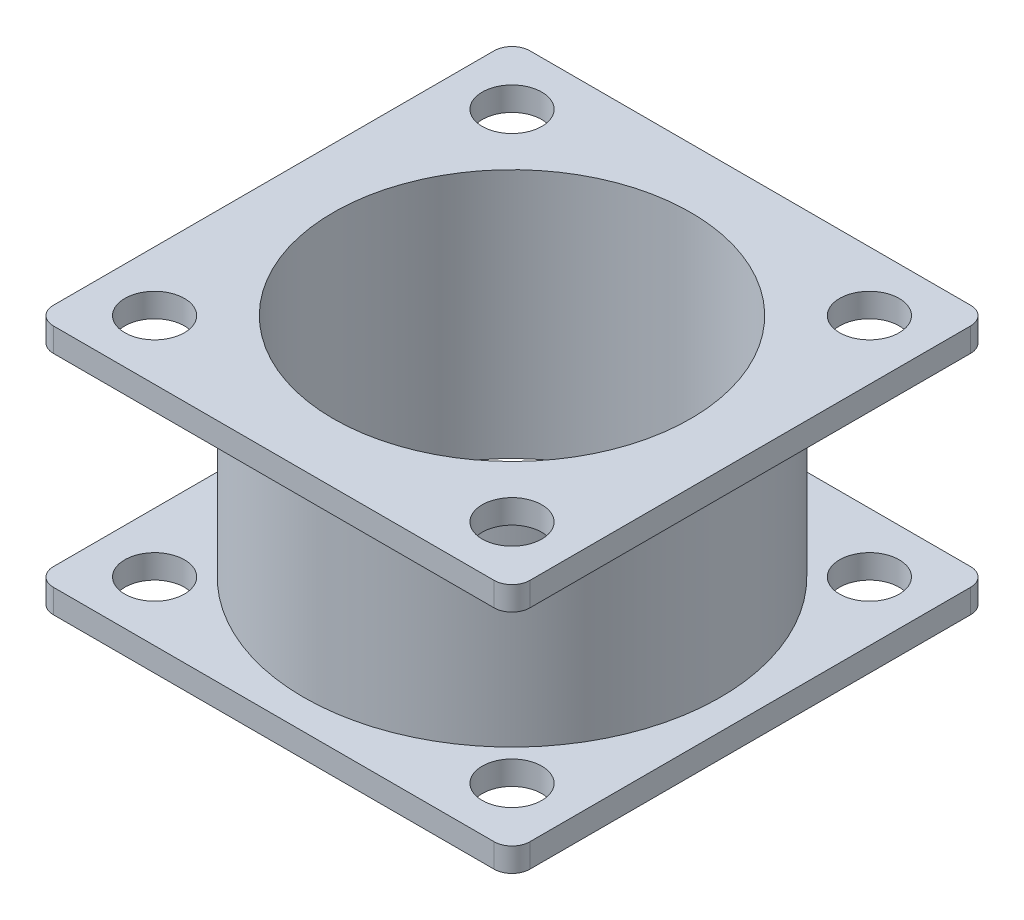
ISO-10303-21;
HEADER;
FILE_DESCRIPTION(('STEP AP214'),'2;1');
FILE_NAME('part.step','',(''),(''),'','','');
FILE_SCHEMA(('AUTOMOTIVE_DESIGN { 1 0 10303 214 1 1 1 1 }'));
ENDSEC;
DATA;
#1=APPLICATION_CONTEXT('core data for automotive mechanical design processes');
#2=APPLICATION_PROTOCOL_DEFINITION('international standard','automotive_design',2000,#1);
#3=PRODUCT_CONTEXT('',#1,'mechanical');
#4=PRODUCT('Part','Part','',(#3));
#5=PRODUCT_RELATED_PRODUCT_CATEGORY('part','',(#4));
#6=PRODUCT_DEFINITION_FORMATION('','',#4);
#7=PRODUCT_DEFINITION_CONTEXT('part definition',#1,'design');
#8=PRODUCT_DEFINITION('design','',#6,#7);
#9=PRODUCT_DEFINITION_SHAPE('','',#8);
#10=(LENGTH_UNIT() NAMED_UNIT(*) SI_UNIT(.MILLI.,.METRE.));
#11=(NAMED_UNIT(*) PLANE_ANGLE_UNIT() SI_UNIT($,.RADIAN.));
#12=(NAMED_UNIT(*) SI_UNIT($,.STERADIAN.) SOLID_ANGLE_UNIT());
#13=UNCERTAINTY_MEASURE_WITH_UNIT(LENGTH_MEASURE(1.E-05),#10,'distance_accuracy_value','');
#14=(GEOMETRIC_REPRESENTATION_CONTEXT(3) GLOBAL_UNCERTAINTY_ASSIGNED_CONTEXT((#13)) GLOBAL_UNIT_ASSIGNED_CONTEXT((#10,
#11,#12)) REPRESENTATION_CONTEXT('',''));
#15=CARTESIAN_POINT('',(0.,0.,0.));
#16=DIRECTION('',(0.,0.,1.));
#17=DIRECTION('',(1.,0.,0.));
#18=AXIS2_PLACEMENT_3D('',#15,#16,#17);
#19=CARTESIAN_POINT('',(-40.,4.,0.));
#20=DIRECTION('',(-1.,0.,0.));
#21=DIRECTION('',(0.,0.,1.));
#22=AXIS2_PLACEMENT_3D('',#19,#20,#21);
#23=PLANE('',#22);
#24=DIRECTION('',(0.,0.,-1.));
#25=VECTOR('',#24,1.);
#26=CARTESIAN_POINT('',(-40.,4.,0.));
#27=LINE('',#26,#25);
#28=CARTESIAN_POINT('',(-40.,4.,37.));
#29=VERTEX_POINT('',#28);
#30=CARTESIAN_POINT('',(-40.,4.,-37.));
#31=VERTEX_POINT('',#30);
#32=EDGE_CURVE('E200',#29,#31,#27,.T.);
#33=ORIENTED_EDGE('',*,*,#32,.T.);
#34=DIRECTION('',(0.,-1.,0.));
#35=VECTOR('',#34,1.);
#36=CARTESIAN_POINT('',(-40.,0.,-37.));
#37=LINE('',#36,#35);
#38=CARTESIAN_POINT('',(-40.,0.,-37.));
#39=VERTEX_POINT('',#38);
#40=EDGE_CURVE('E241',#31,#39,#37,.T.);
#41=ORIENTED_EDGE('',*,*,#40,.T.);
#42=DIRECTION('',(0.,0.,-1.));
#43=VECTOR('',#42,1.);
#44=CARTESIAN_POINT('',(-40.,0.,0.));
#45=LINE('',#44,#43);
#46=CARTESIAN_POINT('',(-40.,0.,37.));
#47=VERTEX_POINT('',#46);
#48=EDGE_CURVE('E202',#47,#39,#45,.T.);
#49=ORIENTED_EDGE('',*,*,#48,.F.);
#50=DIRECTION('',(0.,-1.,0.));
#51=VECTOR('',#50,1.);
#52=CARTESIAN_POINT('',(-40.,4.,37.));
#53=LINE('',#52,#51);
#54=EDGE_CURVE('E238',#47,#29,#53,.F.);
#55=ORIENTED_EDGE('',*,*,#54,.T.);
#56=EDGE_LOOP('',(#33,#41,#49,#55));
#57=FACE_BOUND('',#56,.T.);
#58=ADVANCED_FACE('F49',(#57),#23,.T.);
#59=CARTESIAN_POINT('',(0.,4.,40.));
#60=DIRECTION('',(0.,0.,1.));
#61=DIRECTION('',(1.,0.,0.));
#62=AXIS2_PLACEMENT_3D('',#59,#60,#61);
#63=PLANE('',#62);
#64=DIRECTION('',(-1.,0.,0.));
#65=VECTOR('',#64,1.);
#66=CARTESIAN_POINT('',(0.,4.,40.));
#67=LINE('',#66,#65);
#68=CARTESIAN_POINT('',(37.,4.,40.));
#69=VERTEX_POINT('',#68);
#70=CARTESIAN_POINT('',(-37.,4.,40.));
#71=VERTEX_POINT('',#70);
#72=EDGE_CURVE('E373',#69,#71,#67,.T.);
#73=ORIENTED_EDGE('',*,*,#72,.T.);
#74=DIRECTION('',(0.,-1.,0.));
#75=VECTOR('',#74,1.);
#76=CARTESIAN_POINT('',(-37.,4.,40.));
#77=LINE('',#76,#75);
#78=CARTESIAN_POINT('',(-37.,0.,40.));
#79=VERTEX_POINT('',#78);
#80=EDGE_CURVE('E245',#71,#79,#77,.T.);
#81=ORIENTED_EDGE('',*,*,#80,.T.);
#82=DIRECTION('',(-1.,0.,0.));
#83=VECTOR('',#82,1.);
#84=CARTESIAN_POINT('',(0.,0.,40.));
#85=LINE('',#84,#83);
#86=CARTESIAN_POINT('',(37.,0.,40.));
#87=VERTEX_POINT('',#86);
#88=EDGE_CURVE('E195',#87,#79,#85,.T.);
#89=ORIENTED_EDGE('',*,*,#88,.F.);
#90=DIRECTION('',(0.,-1.,0.));
#91=VECTOR('',#90,1.);
#92=CARTESIAN_POINT('',(37.,4.,40.));
#93=LINE('',#92,#91);
#94=EDGE_CURVE('E172',#87,#69,#93,.F.);
#95=ORIENTED_EDGE('',*,*,#94,.T.);
#96=EDGE_LOOP('',(#73,#81,#89,#95));
#97=FACE_BOUND('',#96,.T.);
#98=ADVANCED_FACE('F396',(#97),#63,.T.);
#99=CARTESIAN_POINT('',(40.,4.,0.));
#100=DIRECTION('',(-1.,0.,0.));
#101=DIRECTION('',(0.,0.,1.));
#102=AXIS2_PLACEMENT_3D('',#99,#100,#101);
#103=PLANE('',#102);
#104=DIRECTION('',(0.,0.,-1.));
#105=VECTOR('',#104,1.);
#106=CARTESIAN_POINT('',(40.,0.,0.));
#107=LINE('',#106,#105);
#108=CARTESIAN_POINT('',(40.,0.,37.));
#109=VERTEX_POINT('',#108);
#110=CARTESIAN_POINT('',(40.,0.,-37.));
#111=VERTEX_POINT('',#110);
#112=EDGE_CURVE('E183',#109,#111,#107,.T.);
#113=ORIENTED_EDGE('',*,*,#112,.T.);
#114=DIRECTION('',(0.,-1.,0.));
#115=VECTOR('',#114,1.);
#116=CARTESIAN_POINT('',(40.,4.,-37.));
#117=LINE('',#116,#115);
#118=CARTESIAN_POINT('',(40.,4.,-37.));
#119=VERTEX_POINT('',#118);
#120=EDGE_CURVE('E226',#111,#119,#117,.F.);
#121=ORIENTED_EDGE('',*,*,#120,.T.);
#122=DIRECTION('',(0.,0.,-1.));
#123=VECTOR('',#122,1.);
#124=CARTESIAN_POINT('',(40.,4.,0.));
#125=LINE('',#124,#123);
#126=CARTESIAN_POINT('',(40.,4.,37.));
#127=VERTEX_POINT('',#126);
#128=EDGE_CURVE('E186',#127,#119,#125,.T.);
#129=ORIENTED_EDGE('',*,*,#128,.F.);
#130=DIRECTION('',(0.,-1.,0.));
#131=VECTOR('',#130,1.);
#132=CARTESIAN_POINT('',(40.,0.,37.));
#133=LINE('',#132,#131);
#134=EDGE_CURVE('E171',#127,#109,#133,.T.);
#135=ORIENTED_EDGE('',*,*,#134,.T.);
#136=EDGE_LOOP('',(#113,#121,#129,#135));
#137=FACE_BOUND('',#136,.T.);
#138=ADVANCED_FACE('F182',(#137),#103,.F.);
#139=CARTESIAN_POINT('',(0.,4.,-40.));
#140=DIRECTION('',(0.,0.,1.));
#141=DIRECTION('',(1.,0.,0.));
#142=AXIS2_PLACEMENT_3D('',#139,#140,#141);
#143=PLANE('',#142);
#144=DIRECTION('',(-1.,0.,0.));
#145=VECTOR('',#144,1.);
#146=CARTESIAN_POINT('',(0.,4.,-40.));
#147=LINE('',#146,#145);
#148=CARTESIAN_POINT('',(37.,4.,-40.));
#149=VERTEX_POINT('',#148);
#150=CARTESIAN_POINT('',(-37.,4.,-40.));
#151=VERTEX_POINT('',#150);
#152=EDGE_CURVE('E188',#149,#151,#147,.T.);
#153=ORIENTED_EDGE('',*,*,#152,.F.);
#154=DIRECTION('',(0.,-1.,0.));
#155=VECTOR('',#154,1.);
#156=CARTESIAN_POINT('',(37.,4.,-40.));
#157=LINE('',#156,#155);
#158=CARTESIAN_POINT('',(37.,0.,-40.));
#159=VERTEX_POINT('',#158);
#160=EDGE_CURVE('E214',#149,#159,#157,.T.);
#161=ORIENTED_EDGE('',*,*,#160,.T.);
#162=DIRECTION('',(-1.,0.,0.));
#163=VECTOR('',#162,1.);
#164=CARTESIAN_POINT('',(0.,0.,-40.));
#165=LINE('',#164,#163);
#166=CARTESIAN_POINT('',(-37.,0.,-40.));
#167=VERTEX_POINT('',#166);
#168=EDGE_CURVE('E194',#159,#167,#165,.T.);
#169=ORIENTED_EDGE('',*,*,#168,.T.);
#170=DIRECTION('',(0.,-1.,0.));
#171=VECTOR('',#170,1.);
#172=CARTESIAN_POINT('',(-37.,4.,-40.));
#173=LINE('',#172,#171);
#174=EDGE_CURVE('E211',#167,#151,#173,.F.);
#175=ORIENTED_EDGE('',*,*,#174,.T.);
#176=EDGE_LOOP('',(#153,#161,#169,#175));
#177=FACE_BOUND('',#176,.T.);
#178=ADVANCED_FACE('F403',(#177),#143,.F.);
#179=CARTESIAN_POINT('',(0.,4.,0.));
#180=DIRECTION('',(0.,1.,0.));
#181=DIRECTION('',(0.,0.,1.));
#182=AXIS2_PLACEMENT_3D('',#179,#180,#181);
#183=PLANE('',#182);
#184=CARTESIAN_POINT('',(-30.0000000000002,4.,29.9999999999998));
#185=DIRECTION('',(0.,1.,0.));
#186=DIRECTION('',(0.,0.,1.));
#187=AXIS2_PLACEMENT_3D('',#184,#185,#186);
#188=CIRCLE('',#187,5.);
#189=CARTESIAN_POINT('',(-30.0000000000002,4.,34.9999999999998));
#190=VERTEX_POINT('',#189);
#191=EDGE_CURVE('E322',#190,#190,#188,.T.);
#192=ORIENTED_EDGE('',*,*,#191,.F.);
#193=EDGE_LOOP('',(#192));
#194=FACE_BOUND('',#193,.T.);
#195=CARTESIAN_POINT('',(29.9999999999999,4.,30.0000000000001));
#196=DIRECTION('',(0.,1.,0.));
#197=DIRECTION('',(0.,0.,1.));
#198=AXIS2_PLACEMENT_3D('',#195,#196,#197);
#199=CIRCLE('',#198,5.);
#200=CARTESIAN_POINT('',(29.9999999999999,4.,35.0000000000001));
#201=VERTEX_POINT('',#200);
#202=EDGE_CURVE('E308',#201,#201,#199,.T.);
#203=ORIENTED_EDGE('',*,*,#202,.F.);
#204=EDGE_LOOP('',(#203));
#205=FACE_BOUND('',#204,.T.);
#206=CARTESIAN_POINT('',(30.,4.,-30.));
#207=DIRECTION('',(0.,1.,0.));
#208=DIRECTION('',(0.,0.,1.));
#209=AXIS2_PLACEMENT_3D('',#206,#207,#208);
#210=CIRCLE('',#209,5.);
#211=CARTESIAN_POINT('',(30.,4.,-25.));
#212=VERTEX_POINT('',#211);
#213=EDGE_CURVE('E304',#212,#212,#210,.T.);
#214=ORIENTED_EDGE('',*,*,#213,.F.);
#215=EDGE_LOOP('',(#214));
#216=FACE_BOUND('',#215,.T.);
#217=CARTESIAN_POINT('',(-29.9999999999997,4.,-30.0000000000003));
#218=DIRECTION('',(0.,1.,0.));
#219=DIRECTION('',(0.,0.,1.));
#220=AXIS2_PLACEMENT_3D('',#217,#218,#219);
#221=CIRCLE('',#220,4.99999999999999);
#222=CARTESIAN_POINT('',(-29.9999999999997,4.,-25.0000000000003));
#223=VERTEX_POINT('',#222);
#224=EDGE_CURVE('E299',#223,#223,#221,.T.);
#225=ORIENTED_EDGE('',*,*,#224,.F.);
#226=EDGE_LOOP('',(#225));
#227=FACE_BOUND('',#226,.T.);
#228=CARTESIAN_POINT('',(0.,4.,0.));
#229=DIRECTION('',(0.,1.,0.));
#230=DIRECTION('',(0.,0.,1.));
#231=AXIS2_PLACEMENT_3D('',#228,#229,#230);
#232=CIRCLE('',#231,35.);
#233=CARTESIAN_POINT('',(0.,4.,35.));
#234=VERTEX_POINT('',#233);
#235=EDGE_CURVE('E249',#234,#234,#232,.T.);
#236=ORIENTED_EDGE('',*,*,#235,.F.);
#237=EDGE_LOOP('',(#236));
#238=FACE_BOUND('',#237,.T.);
#239=ORIENTED_EDGE('',*,*,#128,.T.);
#240=CARTESIAN_POINT('',(37.,4.,-37.));
#241=DIRECTION('',(0.,1.,0.));
#242=DIRECTION('',(0.,0.,1.));
#243=AXIS2_PLACEMENT_3D('',#240,#241,#242);
#244=CIRCLE('',#243,3.);
#245=EDGE_CURVE('E235',#119,#149,#244,.T.);
#246=ORIENTED_EDGE('',*,*,#245,.T.);
#247=ORIENTED_EDGE('',*,*,#152,.T.);
#248=CARTESIAN_POINT('',(-37.,4.,-37.));
#249=DIRECTION('',(0.,1.,0.));
#250=DIRECTION('',(0.,0.,1.));
#251=AXIS2_PLACEMENT_3D('',#248,#249,#250);
#252=CIRCLE('',#251,3.);
#253=EDGE_CURVE('E232',#151,#31,#252,.T.);
#254=ORIENTED_EDGE('',*,*,#253,.T.);
#255=ORIENTED_EDGE('',*,*,#32,.F.);
#256=CARTESIAN_POINT('',(-37.,4.,37.));
#257=DIRECTION('',(0.,1.,0.));
#258=DIRECTION('',(0.,0.,1.));
#259=AXIS2_PLACEMENT_3D('',#256,#257,#258);
#260=CIRCLE('',#259,3.);
#261=EDGE_CURVE('E229',#29,#71,#260,.T.);
#262=ORIENTED_EDGE('',*,*,#261,.T.);
#263=ORIENTED_EDGE('',*,*,#72,.F.);
#264=CARTESIAN_POINT('',(37.,4.,37.));
#265=DIRECTION('',(0.,1.,0.));
#266=DIRECTION('',(0.,0.,1.));
#267=AXIS2_PLACEMENT_3D('',#264,#265,#266);
#268=CIRCLE('',#267,3.);
#269=EDGE_CURVE('E208',#69,#127,#268,.T.);
#270=ORIENTED_EDGE('',*,*,#269,.T.);
#271=EDGE_LOOP('',(#239,#246,#247,#254,#255,#262,#263,#270));
#272=FACE_BOUND('',#271,.T.);
#273=ADVANCED_FACE('F394',(#194,#205,#216,#227,#238,#272),#183,.T.);
#274=CARTESIAN_POINT('',(0.,0.,0.));
#275=DIRECTION('',(0.,1.,0.));
#276=DIRECTION('',(0.,0.,1.));
#277=AXIS2_PLACEMENT_3D('',#274,#275,#276);
#278=PLANE('',#277);
#279=CARTESIAN_POINT('',(-30.0000000000002,0.,29.9999999999998));
#280=DIRECTION('',(0.,1.,0.));
#281=DIRECTION('',(0.,0.,1.));
#282=AXIS2_PLACEMENT_3D('',#279,#280,#281);
#283=CIRCLE('',#282,5.);
#284=CARTESIAN_POINT('',(-30.0000000000002,0.,34.9999999999998));
#285=VERTEX_POINT('',#284);
#286=EDGE_CURVE('E655',#285,#285,#283,.T.);
#287=ORIENTED_EDGE('',*,*,#286,.T.);
#288=EDGE_LOOP('',(#287));
#289=FACE_BOUND('',#288,.T.);
#290=CARTESIAN_POINT('',(29.9999999999999,0.,30.0000000000001));
#291=DIRECTION('',(0.,1.,0.));
#292=DIRECTION('',(0.,0.,1.));
#293=AXIS2_PLACEMENT_3D('',#290,#291,#292);
#294=CIRCLE('',#293,5.);
#295=CARTESIAN_POINT('',(29.9999999999999,0.,35.0000000000001));
#296=VERTEX_POINT('',#295);
#297=EDGE_CURVE('E661',#296,#296,#294,.T.);
#298=ORIENTED_EDGE('',*,*,#297,.T.);
#299=EDGE_LOOP('',(#298));
#300=FACE_BOUND('',#299,.T.);
#301=CARTESIAN_POINT('',(30.,0.,-30.));
#302=DIRECTION('',(0.,1.,0.));
#303=DIRECTION('',(0.,0.,1.));
#304=AXIS2_PLACEMENT_3D('',#301,#302,#303);
#305=CIRCLE('',#304,5.);
#306=CARTESIAN_POINT('',(30.,0.,-25.));
#307=VERTEX_POINT('',#306);
#308=EDGE_CURVE('E674',#307,#307,#305,.T.);
#309=ORIENTED_EDGE('',*,*,#308,.T.);
#310=EDGE_LOOP('',(#309));
#311=FACE_BOUND('',#310,.T.);
#312=CARTESIAN_POINT('',(-29.9999999999997,0.,-30.0000000000003));
#313=DIRECTION('',(0.,1.,0.));
#314=DIRECTION('',(0.,0.,1.));
#315=AXIS2_PLACEMENT_3D('',#312,#313,#314);
#316=CIRCLE('',#315,4.99999999999999);
#317=CARTESIAN_POINT('',(-29.9999999999997,0.,-25.0000000000003));
#318=VERTEX_POINT('',#317);
#319=EDGE_CURVE('E300',#318,#318,#316,.T.);
#320=ORIENTED_EDGE('',*,*,#319,.T.);
#321=EDGE_LOOP('',(#320));
#322=FACE_BOUND('',#321,.T.);
#323=CARTESIAN_POINT('',(0.,0.,0.));
#324=DIRECTION('',(0.,1.,0.));
#325=DIRECTION('',(0.,0.,1.));
#326=AXIS2_PLACEMENT_3D('',#323,#324,#325);
#327=CIRCLE('',#326,30.);
#328=CARTESIAN_POINT('',(0.,0.,30.));
#329=VERTEX_POINT('',#328);
#330=EDGE_CURVE('E327',#329,#329,#327,.T.);
#331=ORIENTED_EDGE('',*,*,#330,.T.);
#332=EDGE_LOOP('',(#331));
#333=FACE_BOUND('',#332,.T.);
#334=ORIENTED_EDGE('',*,*,#168,.F.);
#335=CARTESIAN_POINT('',(37.,0.,-37.));
#336=DIRECTION('',(0.,1.,0.));
#337=DIRECTION('',(0.,0.,1.));
#338=AXIS2_PLACEMENT_3D('',#335,#336,#337);
#339=CIRCLE('',#338,3.);
#340=EDGE_CURVE('E192',#159,#111,#339,.F.);
#341=ORIENTED_EDGE('',*,*,#340,.T.);
#342=ORIENTED_EDGE('',*,*,#112,.F.);
#343=CARTESIAN_POINT('',(37.,0.,37.));
#344=DIRECTION('',(0.,1.,0.));
#345=DIRECTION('',(0.,0.,1.));
#346=AXIS2_PLACEMENT_3D('',#343,#344,#345);
#347=CIRCLE('',#346,3.);
#348=EDGE_CURVE('E167',#109,#87,#347,.F.);
#349=ORIENTED_EDGE('',*,*,#348,.T.);
#350=ORIENTED_EDGE('',*,*,#88,.T.);
#351=CARTESIAN_POINT('',(-37.,0.,37.));
#352=DIRECTION('',(0.,1.,0.));
#353=DIRECTION('',(0.,0.,1.));
#354=AXIS2_PLACEMENT_3D('',#351,#352,#353);
#355=CIRCLE('',#354,3.);
#356=EDGE_CURVE('E218',#79,#47,#355,.F.);
#357=ORIENTED_EDGE('',*,*,#356,.T.);
#358=ORIENTED_EDGE('',*,*,#48,.T.);
#359=CARTESIAN_POINT('',(-37.,0.,-37.));
#360=DIRECTION('',(0.,1.,0.));
#361=DIRECTION('',(0.,0.,1.));
#362=AXIS2_PLACEMENT_3D('',#359,#360,#361);
#363=CIRCLE('',#362,3.);
#364=EDGE_CURVE('E221',#39,#167,#363,.F.);
#365=ORIENTED_EDGE('',*,*,#364,.T.);
#366=EDGE_LOOP('',(#334,#341,#342,#349,#350,#357,#358,#365));
#367=FACE_BOUND('',#366,.T.);
#368=ADVANCED_FACE('F191',(#289,#300,#311,#322,#333,#367),#278,.F.);
#369=CARTESIAN_POINT('',(37.,4.,37.));
#370=DIRECTION('',(0.,1.,0.));
#371=DIRECTION('',(0.,0.,1.));
#372=AXIS2_PLACEMENT_3D('',#369,#370,#371);
#373=CYLINDRICAL_SURFACE('',#372,3.);
#374=ORIENTED_EDGE('',*,*,#269,.F.);
#375=ORIENTED_EDGE('',*,*,#94,.F.);
#376=ORIENTED_EDGE('',*,*,#348,.F.);
#377=ORIENTED_EDGE('',*,*,#134,.F.);
#378=EDGE_LOOP('',(#374,#375,#376,#377));
#379=FACE_BOUND('',#378,.T.);
#380=ADVANCED_FACE('F170',(#379),#373,.T.);
#381=CARTESIAN_POINT('',(37.,4.,-37.));
#382=DIRECTION('',(0.,-1.,0.));
#383=DIRECTION('',(0.,0.,-1.));
#384=AXIS2_PLACEMENT_3D('',#381,#382,#383);
#385=CYLINDRICAL_SURFACE('',#384,3.);
#386=ORIENTED_EDGE('',*,*,#245,.F.);
#387=ORIENTED_EDGE('',*,*,#120,.F.);
#388=ORIENTED_EDGE('',*,*,#340,.F.);
#389=ORIENTED_EDGE('',*,*,#160,.F.);
#390=EDGE_LOOP('',(#386,#387,#388,#389));
#391=FACE_BOUND('',#390,.T.);
#392=ADVANCED_FACE('F410',(#391),#385,.T.);
#393=CARTESIAN_POINT('',(-37.,4.,-37.));
#394=DIRECTION('',(0.,1.,0.));
#395=DIRECTION('',(0.,0.,1.));
#396=AXIS2_PLACEMENT_3D('',#393,#394,#395);
#397=CYLINDRICAL_SURFACE('',#396,3.);
#398=ORIENTED_EDGE('',*,*,#253,.F.);
#399=ORIENTED_EDGE('',*,*,#174,.F.);
#400=ORIENTED_EDGE('',*,*,#364,.F.);
#401=ORIENTED_EDGE('',*,*,#40,.F.);
#402=EDGE_LOOP('',(#398,#399,#400,#401));
#403=FACE_BOUND('',#402,.T.);
#404=ADVANCED_FACE('F413',(#403),#397,.T.);
#405=CARTESIAN_POINT('',(-37.,4.,37.));
#406=DIRECTION('',(0.,-1.,0.));
#407=DIRECTION('',(0.,0.,-1.));
#408=AXIS2_PLACEMENT_3D('',#405,#406,#407);
#409=CYLINDRICAL_SURFACE('',#408,3.);
#410=ORIENTED_EDGE('',*,*,#261,.F.);
#411=ORIENTED_EDGE('',*,*,#54,.F.);
#412=ORIENTED_EDGE('',*,*,#356,.F.);
#413=ORIENTED_EDGE('',*,*,#80,.F.);
#414=EDGE_LOOP('',(#410,#411,#412,#413));
#415=FACE_BOUND('',#414,.T.);
#416=ADVANCED_FACE('F390',(#415),#409,.T.);
#417=CARTESIAN_POINT('',(0.,21.,0.));
#418=DIRECTION('',(0.,-1.,0.));
#419=DIRECTION('',(0.,0.,-1.));
#420=AXIS2_PLACEMENT_3D('',#417,#418,#419);
#421=CYLINDRICAL_SURFACE('',#420,35.);
#422=ORIENTED_EDGE('',*,*,#235,.T.);
#423=EDGE_LOOP('',(#422));
#424=FACE_BOUND('',#423,.T.);
#425=CARTESIAN_POINT('',(0.,38.,0.));
#426=DIRECTION('',(0.,1.,0.));
#427=DIRECTION('',(0.,0.,1.));
#428=AXIS2_PLACEMENT_3D('',#425,#426,#427);
#429=CIRCLE('',#428,35.);
#430=CARTESIAN_POINT('',(0.,38.,35.));
#431=VERTEX_POINT('',#430);
#432=EDGE_CURVE('E350',#431,#431,#429,.T.);
#433=ORIENTED_EDGE('',*,*,#432,.F.);
#434=EDGE_LOOP('',(#433));
#435=FACE_BOUND('',#434,.T.);
#436=ADVANCED_FACE('F420',(#424,#435),#421,.T.);
#437=CARTESIAN_POINT('',(-40.,42.,40.));
#438=DIRECTION('',(1.,0.,0.));
#439=DIRECTION('',(0.,0.,-1.));
#440=AXIS2_PLACEMENT_3D('',#437,#438,#439);
#441=PLANE('',#440);
#442=DIRECTION('',(0.,0.,1.));
#443=VECTOR('',#442,1.);
#444=CARTESIAN_POINT('',(-40.,42.,40.));
#445=LINE('',#444,#443);
#446=CARTESIAN_POINT('',(-40.,42.,-37.));
#447=VERTEX_POINT('',#446);
#448=CARTESIAN_POINT('',(-40.,42.,37.));
#449=VERTEX_POINT('',#448);
#450=EDGE_CURVE('E335',#447,#449,#445,.T.);
#451=ORIENTED_EDGE('',*,*,#450,.F.);
#452=DIRECTION('',(0.,-1.,0.));
#453=VECTOR('',#452,1.);
#454=CARTESIAN_POINT('',(-40.,42.,-37.));
#455=LINE('',#454,#453);
#456=CARTESIAN_POINT('',(-40.,38.,-37.));
#457=VERTEX_POINT('',#456);
#458=EDGE_CURVE('E11',#447,#457,#455,.T.);
#459=ORIENTED_EDGE('',*,*,#458,.T.);
#460=DIRECTION('',(0.,0.,1.));
#461=VECTOR('',#460,1.);
#462=CARTESIAN_POINT('',(-40.,38.,40.));
#463=LINE('',#462,#461);
#464=CARTESIAN_POINT('',(-40.,38.,37.));
#465=VERTEX_POINT('',#464);
#466=EDGE_CURVE('E331',#457,#465,#463,.T.);
#467=ORIENTED_EDGE('',*,*,#466,.T.);
#468=DIRECTION('',(0.,-1.,0.));
#469=VECTOR('',#468,1.);
#470=CARTESIAN_POINT('',(-40.,42.,37.));
#471=LINE('',#470,#469);
#472=EDGE_CURVE('E59',#465,#449,#471,.F.);
#473=ORIENTED_EDGE('',*,*,#472,.T.);
#474=EDGE_LOOP('',(#451,#459,#467,#473));
#475=FACE_BOUND('',#474,.T.);
#476=ADVANCED_FACE('F443',(#475),#441,.F.);
#477=CARTESIAN_POINT('',(40.,42.,40.));
#478=DIRECTION('',(0.,0.,-1.));
#479=DIRECTION('',(-1.,0.,0.));
#480=AXIS2_PLACEMENT_3D('',#477,#478,#479);
#481=PLANE('',#480);
#482=DIRECTION('',(1.,0.,0.));
#483=VECTOR('',#482,1.);
#484=CARTESIAN_POINT('',(40.,38.,40.));
#485=LINE('',#484,#483);
#486=CARTESIAN_POINT('',(-37.,38.,40.));
#487=VERTEX_POINT('',#486);
#488=CARTESIAN_POINT('',(37.,38.,40.));
#489=VERTEX_POINT('',#488);
#490=EDGE_CURVE('E354',#487,#489,#485,.T.);
#491=ORIENTED_EDGE('',*,*,#490,.T.);
#492=DIRECTION('',(0.,-1.,0.));
#493=VECTOR('',#492,1.);
#494=CARTESIAN_POINT('',(37.,42.,40.));
#495=LINE('',#494,#493);
#496=CARTESIAN_POINT('',(37.,42.,40.));
#497=VERTEX_POINT('',#496);
#498=EDGE_CURVE('E273',#489,#497,#495,.F.);
#499=ORIENTED_EDGE('',*,*,#498,.T.);
#500=DIRECTION('',(1.,0.,0.));
#501=VECTOR('',#500,1.);
#502=CARTESIAN_POINT('',(40.,42.,40.));
#503=LINE('',#502,#501);
#504=CARTESIAN_POINT('',(-37.,42.,40.));
#505=VERTEX_POINT('',#504);
#506=EDGE_CURVE('E339',#505,#497,#503,.T.);
#507=ORIENTED_EDGE('',*,*,#506,.F.);
#508=DIRECTION('',(0.,-1.,0.));
#509=VECTOR('',#508,1.);
#510=CARTESIAN_POINT('',(-37.,42.,40.));
#511=LINE('',#510,#509);
#512=EDGE_CURVE('E269',#505,#487,#511,.T.);
#513=ORIENTED_EDGE('',*,*,#512,.T.);
#514=EDGE_LOOP('',(#491,#499,#507,#513));
#515=FACE_BOUND('',#514,.T.);
#516=ADVANCED_FACE('F450',(#515),#481,.F.);
#517=CARTESIAN_POINT('',(40.,42.,40.));
#518=DIRECTION('',(-1.,0.,0.));
#519=DIRECTION('',(0.,0.,1.));
#520=AXIS2_PLACEMENT_3D('',#517,#518,#519);
#521=PLANE('',#520);
#522=DIRECTION('',(0.,0.,-1.));
#523=VECTOR('',#522,1.);
#524=CARTESIAN_POINT('',(40.,42.,40.));
#525=LINE('',#524,#523);
#526=CARTESIAN_POINT('',(40.,42.,37.));
#527=VERTEX_POINT('',#526);
#528=CARTESIAN_POINT('',(40.,42.,-37.));
#529=VERTEX_POINT('',#528);
#530=EDGE_CURVE('E344',#527,#529,#525,.T.);
#531=ORIENTED_EDGE('',*,*,#530,.F.);
#532=DIRECTION('',(0.,-1.,0.));
#533=VECTOR('',#532,1.);
#534=CARTESIAN_POINT('',(40.,42.,37.));
#535=LINE('',#534,#533);
#536=CARTESIAN_POINT('',(40.,38.,37.));
#537=VERTEX_POINT('',#536);
#538=EDGE_CURVE('E253',#527,#537,#535,.T.);
#539=ORIENTED_EDGE('',*,*,#538,.T.);
#540=DIRECTION('',(0.,0.,-1.));
#541=VECTOR('',#540,1.);
#542=CARTESIAN_POINT('',(40.,38.,40.));
#543=LINE('',#542,#541);
#544=CARTESIAN_POINT('',(40.,38.,-37.));
#545=VERTEX_POINT('',#544);
#546=EDGE_CURVE('E358',#537,#545,#543,.T.);
#547=ORIENTED_EDGE('',*,*,#546,.T.);
#548=DIRECTION('',(0.,-1.,0.));
#549=VECTOR('',#548,1.);
#550=CARTESIAN_POINT('',(40.,42.,-37.));
#551=LINE('',#550,#549);
#552=EDGE_CURVE('E250',#545,#529,#551,.F.);
#553=ORIENTED_EDGE('',*,*,#552,.T.);
#554=EDGE_LOOP('',(#531,#539,#547,#553));
#555=FACE_BOUND('',#554,.T.);
#556=ADVANCED_FACE('F456',(#555),#521,.F.);
#557=CARTESIAN_POINT('',(40.,42.,-40.));
#558=DIRECTION('',(0.,0.,1.));
#559=DIRECTION('',(1.,0.,0.));
#560=AXIS2_PLACEMENT_3D('',#557,#558,#559);
#561=PLANE('',#560);
#562=DIRECTION('',(-1.,0.,0.));
#563=VECTOR('',#562,1.);
#564=CARTESIAN_POINT('',(40.,42.,-40.));
#565=LINE('',#564,#563);
#566=CARTESIAN_POINT('',(37.,42.,-40.));
#567=VERTEX_POINT('',#566);
#568=CARTESIAN_POINT('',(-37.,42.,-40.));
#569=VERTEX_POINT('',#568);
#570=EDGE_CURVE('E347',#567,#569,#565,.T.);
#571=ORIENTED_EDGE('',*,*,#570,.F.);
#572=DIRECTION('',(0.,-1.,0.));
#573=VECTOR('',#572,1.);
#574=CARTESIAN_POINT('',(37.,42.,-40.));
#575=LINE('',#574,#573);
#576=CARTESIAN_POINT('',(37.,38.,-40.));
#577=VERTEX_POINT('',#576);
#578=EDGE_CURVE('E289',#567,#577,#575,.T.);
#579=ORIENTED_EDGE('',*,*,#578,.T.);
#580=DIRECTION('',(-1.,0.,0.));
#581=VECTOR('',#580,1.);
#582=CARTESIAN_POINT('',(40.,38.,-40.));
#583=LINE('',#582,#581);
#584=CARTESIAN_POINT('',(-37.,38.,-40.));
#585=VERTEX_POINT('',#584);
#586=EDGE_CURVE('E340',#577,#585,#583,.T.);
#587=ORIENTED_EDGE('',*,*,#586,.T.);
#588=DIRECTION('',(0.,-1.,0.));
#589=VECTOR('',#588,1.);
#590=CARTESIAN_POINT('',(-37.,42.,-40.));
#591=LINE('',#590,#589);
#592=EDGE_CURVE('E67',#585,#569,#591,.F.);
#593=ORIENTED_EDGE('',*,*,#592,.T.);
#594=EDGE_LOOP('',(#571,#579,#587,#593));
#595=FACE_BOUND('',#594,.T.);
#596=ADVANCED_FACE('F461',(#595),#561,.F.);
#597=CARTESIAN_POINT('',(0.,42.,0.));
#598=DIRECTION('',(0.,1.,0.));
#599=DIRECTION('',(0.,0.,1.));
#600=AXIS2_PLACEMENT_3D('',#597,#598,#599);
#601=PLANE('',#600);
#602=CARTESIAN_POINT('',(-30.0000000000002,42.,29.9999999999998));
#603=DIRECTION('',(0.,1.,0.));
#604=DIRECTION('',(0.,0.,1.));
#605=AXIS2_PLACEMENT_3D('',#602,#603,#604);
#606=CIRCLE('',#605,5.);
#607=CARTESIAN_POINT('',(-30.0000000000002,42.,34.9999999999998));
#608=VERTEX_POINT('',#607);
#609=EDGE_CURVE('E657',#608,#608,#606,.T.);
#610=ORIENTED_EDGE('',*,*,#609,.F.);
#611=EDGE_LOOP('',(#610));
#612=FACE_BOUND('',#611,.T.);
#613=CARTESIAN_POINT('',(29.9999999999999,42.,30.0000000000001));
#614=DIRECTION('',(0.,1.,0.));
#615=DIRECTION('',(0.,0.,1.));
#616=AXIS2_PLACEMENT_3D('',#613,#614,#615);
#617=CIRCLE('',#616,5.);
#618=CARTESIAN_POINT('',(29.9999999999999,42.,35.0000000000001));
#619=VERTEX_POINT('',#618);
#620=EDGE_CURVE('E679',#619,#619,#617,.T.);
#621=ORIENTED_EDGE('',*,*,#620,.F.);
#622=EDGE_LOOP('',(#621));
#623=FACE_BOUND('',#622,.T.);
#624=CARTESIAN_POINT('',(30.,42.,-30.));
#625=DIRECTION('',(0.,1.,0.));
#626=DIRECTION('',(0.,0.,1.));
#627=AXIS2_PLACEMENT_3D('',#624,#625,#626);
#628=CIRCLE('',#627,5.);
#629=CARTESIAN_POINT('',(30.,42.,-25.));
#630=VERTEX_POINT('',#629);
#631=EDGE_CURVE('E670',#630,#630,#628,.T.);
#632=ORIENTED_EDGE('',*,*,#631,.F.);
#633=EDGE_LOOP('',(#632));
#634=FACE_BOUND('',#633,.T.);
#635=CARTESIAN_POINT('',(-29.9999999999997,42.,-30.0000000000003));
#636=DIRECTION('',(0.,1.,0.));
#637=DIRECTION('',(0.,0.,1.));
#638=AXIS2_PLACEMENT_3D('',#635,#636,#637);
#639=CIRCLE('',#638,4.99999999999999);
#640=CARTESIAN_POINT('',(-29.9999999999997,42.,-25.0000000000003));
#641=VERTEX_POINT('',#640);
#642=EDGE_CURVE('E667',#641,#641,#639,.T.);
#643=ORIENTED_EDGE('',*,*,#642,.F.);
#644=EDGE_LOOP('',(#643));
#645=FACE_BOUND('',#644,.T.);
#646=CARTESIAN_POINT('',(0.,42.,0.));
#647=DIRECTION('',(0.,1.,0.));
#648=DIRECTION('',(0.,0.,1.));
#649=AXIS2_PLACEMENT_3D('',#646,#647,#648);
#650=CIRCLE('',#649,30.);
#651=CARTESIAN_POINT('',(0.,42.,30.));
#652=VERTEX_POINT('',#651);
#653=EDGE_CURVE('E326',#652,#652,#650,.T.);
#654=ORIENTED_EDGE('',*,*,#653,.F.);
#655=EDGE_LOOP('',(#654));
#656=FACE_BOUND('',#655,.T.);
#657=ORIENTED_EDGE('',*,*,#506,.T.);
#658=CARTESIAN_POINT('',(37.,42.,37.));
#659=DIRECTION('',(0.,1.,0.));
#660=DIRECTION('',(0.,0.,1.));
#661=AXIS2_PLACEMENT_3D('',#658,#659,#660);
#662=CIRCLE('',#661,3.);
#663=EDGE_CURVE('E284',#497,#527,#662,.T.);
#664=ORIENTED_EDGE('',*,*,#663,.T.);
#665=ORIENTED_EDGE('',*,*,#530,.T.);
#666=CARTESIAN_POINT('',(37.,42.,-37.));
#667=DIRECTION('',(0.,1.,0.));
#668=DIRECTION('',(0.,0.,1.));
#669=AXIS2_PLACEMENT_3D('',#666,#667,#668);
#670=CIRCLE('',#669,3.);
#671=EDGE_CURVE('E74',#529,#567,#670,.T.);
#672=ORIENTED_EDGE('',*,*,#671,.T.);
#673=ORIENTED_EDGE('',*,*,#570,.T.);
#674=CARTESIAN_POINT('',(-37.,42.,-37.));
#675=DIRECTION('',(0.,1.,0.));
#676=DIRECTION('',(0.,0.,1.));
#677=AXIS2_PLACEMENT_3D('',#674,#675,#676);
#678=CIRCLE('',#677,3.);
#679=EDGE_CURVE('E279',#569,#447,#678,.T.);
#680=ORIENTED_EDGE('',*,*,#679,.T.);
#681=ORIENTED_EDGE('',*,*,#450,.T.);
#682=CARTESIAN_POINT('',(-37.,42.,37.));
#683=DIRECTION('',(0.,1.,0.));
#684=DIRECTION('',(0.,0.,1.));
#685=AXIS2_PLACEMENT_3D('',#682,#683,#684);
#686=CIRCLE('',#685,3.);
#687=EDGE_CURVE('E276',#449,#505,#686,.T.);
#688=ORIENTED_EDGE('',*,*,#687,.T.);
#689=EDGE_LOOP('',(#657,#664,#665,#672,#673,#680,#681,#688));
#690=FACE_BOUND('',#689,.T.);
#691=ADVANCED_FACE('F440',(#612,#623,#634,#645,#656,#690),#601,.T.);
#692=CARTESIAN_POINT('',(0.,38.,0.));
#693=DIRECTION('',(0.,1.,0.));
#694=DIRECTION('',(0.,0.,1.));
#695=AXIS2_PLACEMENT_3D('',#692,#693,#694);
#696=PLANE('',#695);
#697=CARTESIAN_POINT('',(-30.0000000000002,38.,29.9999999999998));
#698=DIRECTION('',(0.,1.,0.));
#699=DIRECTION('',(0.,0.,1.));
#700=AXIS2_PLACEMENT_3D('',#697,#698,#699);
#701=CIRCLE('',#700,5.);
#702=CARTESIAN_POINT('',(-30.0000000000002,38.,34.9999999999998));
#703=VERTEX_POINT('',#702);
#704=EDGE_CURVE('E53',#703,#703,#701,.T.);
#705=ORIENTED_EDGE('',*,*,#704,.T.);
#706=EDGE_LOOP('',(#705));
#707=FACE_BOUND('',#706,.T.);
#708=CARTESIAN_POINT('',(29.9999999999999,38.,30.0000000000001));
#709=DIRECTION('',(0.,1.,0.));
#710=DIRECTION('',(0.,0.,1.));
#711=AXIS2_PLACEMENT_3D('',#708,#709,#710);
#712=CIRCLE('',#711,5.);
#713=CARTESIAN_POINT('',(29.9999999999999,38.,35.0000000000001));
#714=VERTEX_POINT('',#713);
#715=EDGE_CURVE('E305',#714,#714,#712,.T.);
#716=ORIENTED_EDGE('',*,*,#715,.T.);
#717=EDGE_LOOP('',(#716));
#718=FACE_BOUND('',#717,.T.);
#719=CARTESIAN_POINT('',(30.,38.,-30.));
#720=DIRECTION('',(0.,1.,0.));
#721=DIRECTION('',(0.,0.,1.));
#722=AXIS2_PLACEMENT_3D('',#719,#720,#721);
#723=CIRCLE('',#722,5.);
#724=CARTESIAN_POINT('',(30.,38.,-25.));
#725=VERTEX_POINT('',#724);
#726=EDGE_CURVE('E301',#725,#725,#723,.T.);
#727=ORIENTED_EDGE('',*,*,#726,.T.);
#728=EDGE_LOOP('',(#727));
#729=FACE_BOUND('',#728,.T.);
#730=CARTESIAN_POINT('',(-29.9999999999997,38.,-30.0000000000003));
#731=DIRECTION('',(0.,1.,0.));
#732=DIRECTION('',(0.,0.,1.));
#733=AXIS2_PLACEMENT_3D('',#730,#731,#732);
#734=CIRCLE('',#733,4.99999999999999);
#735=CARTESIAN_POINT('',(-29.9999999999997,38.,-25.0000000000003));
#736=VERTEX_POINT('',#735);
#737=EDGE_CURVE('E295',#736,#736,#734,.T.);
#738=ORIENTED_EDGE('',*,*,#737,.T.);
#739=EDGE_LOOP('',(#738));
#740=FACE_BOUND('',#739,.T.);
#741=ORIENTED_EDGE('',*,*,#432,.T.);
#742=EDGE_LOOP('',(#741));
#743=FACE_BOUND('',#742,.T.);
#744=ORIENTED_EDGE('',*,*,#546,.F.);
#745=CARTESIAN_POINT('',(37.,38.,37.));
#746=DIRECTION('',(0.,1.,0.));
#747=DIRECTION('',(0.,0.,1.));
#748=AXIS2_PLACEMENT_3D('',#745,#746,#747);
#749=CIRCLE('',#748,3.);
#750=EDGE_CURVE('E266',#537,#489,#749,.F.);
#751=ORIENTED_EDGE('',*,*,#750,.T.);
#752=ORIENTED_EDGE('',*,*,#490,.F.);
#753=CARTESIAN_POINT('',(-37.,38.,37.));
#754=DIRECTION('',(0.,1.,0.));
#755=DIRECTION('',(0.,0.,1.));
#756=AXIS2_PLACEMENT_3D('',#753,#754,#755);
#757=CIRCLE('',#756,3.);
#758=EDGE_CURVE('E257',#487,#465,#757,.F.);
#759=ORIENTED_EDGE('',*,*,#758,.T.);
#760=ORIENTED_EDGE('',*,*,#466,.F.);
#761=CARTESIAN_POINT('',(-37.,38.,-37.));
#762=DIRECTION('',(0.,1.,0.));
#763=DIRECTION('',(0.,0.,1.));
#764=AXIS2_PLACEMENT_3D('',#761,#762,#763);
#765=CIRCLE('',#764,3.);
#766=EDGE_CURVE('E260',#457,#585,#765,.F.);
#767=ORIENTED_EDGE('',*,*,#766,.T.);
#768=ORIENTED_EDGE('',*,*,#586,.F.);
#769=CARTESIAN_POINT('',(37.,38.,-37.));
#770=DIRECTION('',(0.,1.,0.));
#771=DIRECTION('',(0.,0.,1.));
#772=AXIS2_PLACEMENT_3D('',#769,#770,#771);
#773=CIRCLE('',#772,3.);
#774=EDGE_CURVE('E263',#577,#545,#773,.F.);
#775=ORIENTED_EDGE('',*,*,#774,.T.);
#776=EDGE_LOOP('',(#744,#751,#752,#759,#760,#767,#768,#775));
#777=FACE_BOUND('',#776,.T.);
#778=ADVANCED_FACE('F425',(#707,#718,#729,#740,#743,#777),#696,.F.);
#779=CARTESIAN_POINT('',(37.,42.,37.));
#780=DIRECTION('',(0.,-1.,0.));
#781=DIRECTION('',(0.,0.,-1.));
#782=AXIS2_PLACEMENT_3D('',#779,#780,#781);
#783=CYLINDRICAL_SURFACE('',#782,3.);
#784=ORIENTED_EDGE('',*,*,#663,.F.);
#785=ORIENTED_EDGE('',*,*,#498,.F.);
#786=ORIENTED_EDGE('',*,*,#750,.F.);
#787=ORIENTED_EDGE('',*,*,#538,.F.);
#788=EDGE_LOOP('',(#784,#785,#786,#787));
#789=FACE_BOUND('',#788,.T.);
#790=ADVANCED_FACE('F421',(#789),#783,.T.);
#791=CARTESIAN_POINT('',(37.,42.,-37.));
#792=DIRECTION('',(0.,-1.,0.));
#793=DIRECTION('',(0.,0.,-1.));
#794=AXIS2_PLACEMENT_3D('',#791,#792,#793);
#795=CYLINDRICAL_SURFACE('',#794,3.);
#796=ORIENTED_EDGE('',*,*,#671,.F.);
#797=ORIENTED_EDGE('',*,*,#552,.F.);
#798=ORIENTED_EDGE('',*,*,#774,.F.);
#799=ORIENTED_EDGE('',*,*,#578,.F.);
#800=EDGE_LOOP('',(#796,#797,#798,#799));
#801=FACE_BOUND('',#800,.T.);
#802=ADVANCED_FACE('F424',(#801),#795,.T.);
#803=CARTESIAN_POINT('',(-37.,42.,-37.));
#804=DIRECTION('',(0.,-1.,0.));
#805=DIRECTION('',(0.,0.,-1.));
#806=AXIS2_PLACEMENT_3D('',#803,#804,#805);
#807=CYLINDRICAL_SURFACE('',#806,3.);
#808=ORIENTED_EDGE('',*,*,#679,.F.);
#809=ORIENTED_EDGE('',*,*,#592,.F.);
#810=ORIENTED_EDGE('',*,*,#766,.F.);
#811=ORIENTED_EDGE('',*,*,#458,.F.);
#812=EDGE_LOOP('',(#808,#809,#810,#811));
#813=FACE_BOUND('',#812,.T.);
#814=ADVANCED_FACE('F428',(#813),#807,.T.);
#815=CARTESIAN_POINT('',(-37.,42.,37.));
#816=DIRECTION('',(0.,-1.,0.));
#817=DIRECTION('',(0.,0.,-1.));
#818=AXIS2_PLACEMENT_3D('',#815,#816,#817);
#819=CYLINDRICAL_SURFACE('',#818,3.);
#820=ORIENTED_EDGE('',*,*,#687,.F.);
#821=ORIENTED_EDGE('',*,*,#472,.F.);
#822=ORIENTED_EDGE('',*,*,#758,.F.);
#823=ORIENTED_EDGE('',*,*,#512,.F.);
#824=EDGE_LOOP('',(#820,#821,#822,#823));
#825=FACE_BOUND('',#824,.T.);
#826=ADVANCED_FACE('F51',(#825),#819,.T.);
#827=CARTESIAN_POINT('',(0.,0.,0.));
#828=DIRECTION('',(0.,1.,0.));
#829=DIRECTION('',(0.,0.,1.));
#830=AXIS2_PLACEMENT_3D('',#827,#828,#829);
#831=CYLINDRICAL_SURFACE('',#830,30.);
#832=ORIENTED_EDGE('',*,*,#330,.F.);
#833=EDGE_LOOP('',(#832));
#834=FACE_BOUND('',#833,.T.);
#835=ORIENTED_EDGE('',*,*,#653,.T.);
#836=EDGE_LOOP('',(#835));
#837=FACE_BOUND('',#836,.T.);
#838=ADVANCED_FACE('F435',(#834,#837),#831,.F.);
#839=CARTESIAN_POINT('',(-29.9999999999997,0.,-30.0000000000003));
#840=DIRECTION('',(0.,1.,0.));
#841=DIRECTION('',(0.,0.,1.));
#842=AXIS2_PLACEMENT_3D('',#839,#840,#841);
#843=CYLINDRICAL_SURFACE('',#842,4.99999999999999);
#844=ORIENTED_EDGE('',*,*,#642,.T.);
#845=EDGE_LOOP('',(#844));
#846=FACE_BOUND('',#845,.T.);
#847=ORIENTED_EDGE('',*,*,#737,.F.);
#848=EDGE_LOOP('',(#847));
#849=FACE_BOUND('',#848,.T.);
#850=ADVANCED_FACE('F575',(#846,#849),#843,.F.);
#851=CARTESIAN_POINT('',(30.,0.,-30.));
#852=DIRECTION('',(0.,1.,0.));
#853=DIRECTION('',(0.,0.,1.));
#854=AXIS2_PLACEMENT_3D('',#851,#852,#853);
#855=CYLINDRICAL_SURFACE('',#854,5.);
#856=ORIENTED_EDGE('',*,*,#631,.T.);
#857=EDGE_LOOP('',(#856));
#858=FACE_BOUND('',#857,.T.);
#859=ORIENTED_EDGE('',*,*,#726,.F.);
#860=EDGE_LOOP('',(#859));
#861=FACE_BOUND('',#860,.T.);
#862=ADVANCED_FACE('F583',(#858,#861),#855,.F.);
#863=CARTESIAN_POINT('',(29.9999999999999,0.,30.0000000000001));
#864=DIRECTION('',(0.,1.,0.));
#865=DIRECTION('',(0.,0.,1.));
#866=AXIS2_PLACEMENT_3D('',#863,#864,#865);
#867=CYLINDRICAL_SURFACE('',#866,5.);
#868=ORIENTED_EDGE('',*,*,#620,.T.);
#869=EDGE_LOOP('',(#868));
#870=FACE_BOUND('',#869,.T.);
#871=ORIENTED_EDGE('',*,*,#715,.F.);
#872=EDGE_LOOP('',(#871));
#873=FACE_BOUND('',#872,.T.);
#874=ADVANCED_FACE('F594',(#870,#873),#867,.F.);
#875=CARTESIAN_POINT('',(-30.0000000000002,0.,29.9999999999998));
#876=DIRECTION('',(0.,1.,0.));
#877=DIRECTION('',(0.,0.,1.));
#878=AXIS2_PLACEMENT_3D('',#875,#876,#877);
#879=CYLINDRICAL_SURFACE('',#878,5.);
#880=ORIENTED_EDGE('',*,*,#609,.T.);
#881=EDGE_LOOP('',(#880));
#882=FACE_BOUND('',#881,.T.);
#883=ORIENTED_EDGE('',*,*,#704,.F.);
#884=EDGE_LOOP('',(#883));
#885=FACE_BOUND('',#884,.T.);
#886=ADVANCED_FACE('F605',(#882,#885),#879,.F.);
#887=ORIENTED_EDGE('',*,*,#224,.T.);
#888=EDGE_LOOP('',(#887));
#889=FACE_BOUND('',#888,.T.);
#890=ORIENTED_EDGE('',*,*,#319,.F.);
#891=EDGE_LOOP('',(#890));
#892=FACE_BOUND('',#891,.T.);
#893=ADVANCED_FACE('F586',(#889,#892),#843,.F.);
#894=ORIENTED_EDGE('',*,*,#213,.T.);
#895=EDGE_LOOP('',(#894));
#896=FACE_BOUND('',#895,.T.);
#897=ORIENTED_EDGE('',*,*,#308,.F.);
#898=EDGE_LOOP('',(#897));
#899=FACE_BOUND('',#898,.T.);
#900=ADVANCED_FACE('F597',(#896,#899),#855,.F.);
#901=ORIENTED_EDGE('',*,*,#202,.T.);
#902=EDGE_LOOP('',(#901));
#903=FACE_BOUND('',#902,.T.);
#904=ORIENTED_EDGE('',*,*,#297,.F.);
#905=EDGE_LOOP('',(#904));
#906=FACE_BOUND('',#905,.T.);
#907=ADVANCED_FACE('F608',(#903,#906),#867,.F.);
#908=ORIENTED_EDGE('',*,*,#191,.T.);
#909=EDGE_LOOP('',(#908));
#910=FACE_BOUND('',#909,.T.);
#911=ORIENTED_EDGE('',*,*,#286,.F.);
#912=EDGE_LOOP('',(#911));
#913=FACE_BOUND('',#912,.T.);
#914=ADVANCED_FACE('F618',(#910,#913),#879,.F.);
#915=CLOSED_SHELL('',(#58,#98,#138,#178,#273,#368,#380,#392,#404,#416,#436,#476,#516,#556,#596,
#691,#778,#790,#802,#814,#826,#838,#850,#862,#874,#886,#893,#900,#907,#914));
#916=MANIFOLD_SOLID_BREP('B2',#915);
#917=ADVANCED_BREP_SHAPE_REPRESENTATION('',(#18,#916),#14);
#918=SHAPE_DEFINITION_REPRESENTATION(#9,#917);
ENDSEC;
END-ISO-10303-21;
